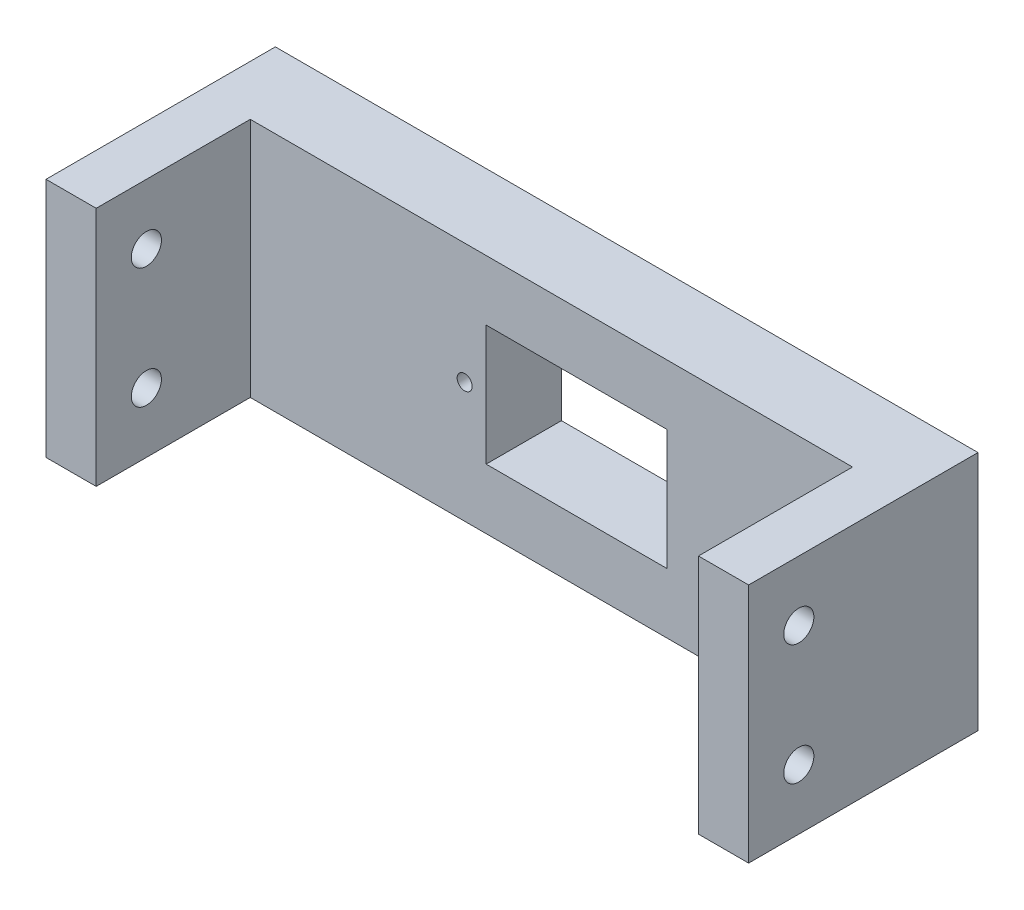
ISO-10303-21;
HEADER;
FILE_DESCRIPTION(('STEP AP214'),'2;1');
FILE_NAME('part.step','',(''),(''),'','','');
FILE_SCHEMA(('AUTOMOTIVE_DESIGN { 1 0 10303 214 1 1 1 1 }'));
ENDSEC;
DATA;
#1=APPLICATION_CONTEXT('core data for automotive mechanical design processes');
#2=APPLICATION_PROTOCOL_DEFINITION('international standard','automotive_design',2000,#1);
#3=PRODUCT_CONTEXT('',#1,'mechanical');
#4=PRODUCT('Part','Part','',(#3));
#5=PRODUCT_RELATED_PRODUCT_CATEGORY('part','',(#4));
#6=PRODUCT_DEFINITION_FORMATION('','',#4);
#7=PRODUCT_DEFINITION_CONTEXT('part definition',#1,'design');
#8=PRODUCT_DEFINITION('design','',#6,#7);
#9=PRODUCT_DEFINITION_SHAPE('','',#8);
#10=(LENGTH_UNIT() NAMED_UNIT(*) SI_UNIT(.MILLI.,.METRE.));
#11=(NAMED_UNIT(*) PLANE_ANGLE_UNIT() SI_UNIT($,.RADIAN.));
#12=(NAMED_UNIT(*) SI_UNIT($,.STERADIAN.) SOLID_ANGLE_UNIT());
#13=UNCERTAINTY_MEASURE_WITH_UNIT(LENGTH_MEASURE(1.E-05),#10,'distance_accuracy_value','');
#14=(GEOMETRIC_REPRESENTATION_CONTEXT(3) GLOBAL_UNCERTAINTY_ASSIGNED_CONTEXT((#13)) GLOBAL_UNIT_ASSIGNED_CONTEXT((#10,
#11,#12)) REPRESENTATION_CONTEXT('',''));
#15=CARTESIAN_POINT('',(0.,0.,0.));
#16=DIRECTION('',(0.,0.,1.));
#17=DIRECTION('',(1.,0.,0.));
#18=AXIS2_PLACEMENT_3D('',#15,#16,#17);
#19=CARTESIAN_POINT('',(-30.,24.,0.));
#20=DIRECTION('',(1.,0.,0.));
#21=DIRECTION('',(0.,0.,-1.));
#22=AXIS2_PLACEMENT_3D('',#19,#20,#21);
#23=PLANE('',#22);
#24=CARTESIAN_POINT('',(-30.,18.,14.1));
#25=DIRECTION('',(1.,0.,0.));
#26=DIRECTION('',(0.,0.,-1.));
#27=AXIS2_PLACEMENT_3D('',#24,#25,#26);
#28=CIRCLE('',#27,1.5);
#29=CARTESIAN_POINT('',(-30.,18.,12.6));
#30=VERTEX_POINT('',#29);
#31=EDGE_CURVE('E205',#30,#30,#28,.T.);
#32=ORIENTED_EDGE('',*,*,#31,.F.);
#33=EDGE_LOOP('',(#32));
#34=FACE_BOUND('',#33,.T.);
#35=CARTESIAN_POINT('',(-30.,6.,14.1));
#36=DIRECTION('',(1.,0.,0.));
#37=DIRECTION('',(0.,0.,-1.));
#38=AXIS2_PLACEMENT_3D('',#35,#36,#37);
#39=CIRCLE('',#38,1.5);
#40=CARTESIAN_POINT('',(-30.,6.,12.6));
#41=VERTEX_POINT('',#40);
#42=EDGE_CURVE('E197',#41,#41,#39,.T.);
#43=ORIENTED_EDGE('',*,*,#42,.F.);
#44=EDGE_LOOP('',(#43));
#45=FACE_BOUND('',#44,.T.);
#46=DIRECTION('',(0.,0.,1.));
#47=VECTOR('',#46,1.);
#48=CARTESIAN_POINT('',(-30.,0.,0.));
#49=LINE('',#48,#47);
#50=CARTESIAN_POINT('',(-30.,0.,3.74999999999998));
#51=VERTEX_POINT('',#50);
#52=CARTESIAN_POINT('',(-30.,0.,19.1));
#53=VERTEX_POINT('',#52);
#54=EDGE_CURVE('E209',#51,#53,#49,.T.);
#55=ORIENTED_EDGE('',*,*,#54,.F.);
#56=DIRECTION('',(0.,-1.,0.));
#57=VECTOR('',#56,1.);
#58=CARTESIAN_POINT('',(-30.,24.,3.74999999999998));
#59=LINE('',#58,#57);
#60=CARTESIAN_POINT('',(-30.,24.,3.74999999999998));
#61=VERTEX_POINT('',#60);
#62=EDGE_CURVE('E11',#61,#51,#59,.T.);
#63=ORIENTED_EDGE('',*,*,#62,.F.);
#64=DIRECTION('',(0.,0.,1.));
#65=VECTOR('',#64,1.);
#66=CARTESIAN_POINT('',(-30.,24.,0.));
#67=LINE('',#66,#65);
#68=CARTESIAN_POINT('',(-30.,24.,19.1));
#69=VERTEX_POINT('',#68);
#70=EDGE_CURVE('E210',#61,#69,#67,.T.);
#71=ORIENTED_EDGE('',*,*,#70,.T.);
#72=DIRECTION('',(0.,-1.,0.));
#73=VECTOR('',#72,1.);
#74=CARTESIAN_POINT('',(-30.,24.,19.1));
#75=LINE('',#74,#73);
#76=EDGE_CURVE('E239',#69,#53,#75,.T.);
#77=ORIENTED_EDGE('',*,*,#76,.T.);
#78=EDGE_LOOP('',(#55,#63,#71,#77));
#79=FACE_BOUND('',#78,.T.);
#80=ADVANCED_FACE('F42',(#34,#45,#79),#23,.T.);
#81=CARTESIAN_POINT('',(0.,24.,3.74999999999999));
#82=DIRECTION('',(0.,0.,-1.));
#83=DIRECTION('',(-1.,0.,0.));
#84=AXIS2_PLACEMENT_3D('',#81,#82,#83);
#85=PLANE('',#84);
#86=CARTESIAN_POINT('',(19.16,12.,3.74999999999999));
#87=DIRECTION('',(0.,0.,-1.));
#88=DIRECTION('',(-1.,0.,0.));
#89=AXIS2_PLACEMENT_3D('',#86,#87,#88);
#90=CIRCLE('',#89,0.750000000000002);
#91=CARTESIAN_POINT('',(18.41,12.,3.74999999999999));
#92=VERTEX_POINT('',#91);
#93=EDGE_CURVE('E388',#92,#92,#90,.T.);
#94=ORIENTED_EDGE('',*,*,#93,.T.);
#95=EDGE_LOOP('',(#94));
#96=FACE_BOUND('',#95,.T.);
#97=CARTESIAN_POINT('',(-8.64,12.,3.74999999999999));
#98=DIRECTION('',(0.,0.,-1.));
#99=DIRECTION('',(-1.,0.,0.));
#100=AXIS2_PLACEMENT_3D('',#97,#98,#99);
#101=CIRCLE('',#100,0.75);
#102=CARTESIAN_POINT('',(-9.39,12.,3.74999999999999));
#103=VERTEX_POINT('',#102);
#104=EDGE_CURVE('E390',#103,#103,#101,.T.);
#105=ORIENTED_EDGE('',*,*,#104,.T.);
#106=EDGE_LOOP('',(#105));
#107=FACE_BOUND('',#106,.T.);
#108=DIRECTION('',(1.,0.,0.));
#109=VECTOR('',#108,1.);
#110=CARTESIAN_POINT('',(-6.49999999999999,6.,3.74999999999999));
#111=LINE('',#110,#109);
#112=CARTESIAN_POINT('',(-6.5,6.,3.74999999999999));
#113=VERTEX_POINT('',#112);
#114=CARTESIAN_POINT('',(11.5,6.,3.74999999999999));
#115=VERTEX_POINT('',#114);
#116=EDGE_CURVE('E152',#113,#115,#111,.T.);
#117=ORIENTED_EDGE('',*,*,#116,.F.);
#118=DIRECTION('',(0.,-1.,0.));
#119=VECTOR('',#118,1.);
#120=CARTESIAN_POINT('',(-6.5,18.,3.74999999999999));
#121=LINE('',#120,#119);
#122=CARTESIAN_POINT('',(-6.5,18.,3.74999999999999));
#123=VERTEX_POINT('',#122);
#124=EDGE_CURVE('E132',#123,#113,#121,.T.);
#125=ORIENTED_EDGE('',*,*,#124,.F.);
#126=DIRECTION('',(-1.,0.,0.));
#127=VECTOR('',#126,1.);
#128=CARTESIAN_POINT('',(-6.49999999999999,18.,3.74999999999999));
#129=LINE('',#128,#127);
#130=CARTESIAN_POINT('',(11.5,18.,3.74999999999999));
#131=VERTEX_POINT('',#130);
#132=EDGE_CURVE('E142',#131,#123,#129,.T.);
#133=ORIENTED_EDGE('',*,*,#132,.F.);
#134=DIRECTION('',(0.,1.,0.));
#135=VECTOR('',#134,1.);
#136=CARTESIAN_POINT('',(11.5,18.,3.74999999999999));
#137=LINE('',#136,#135);
#138=EDGE_CURVE('E57',#115,#131,#137,.T.);
#139=ORIENTED_EDGE('',*,*,#138,.F.);
#140=EDGE_LOOP('',(#117,#125,#133,#139));
#141=FACE_BOUND('',#140,.T.);
#142=DIRECTION('',(1.,0.,0.));
#143=VECTOR('',#142,1.);
#144=CARTESIAN_POINT('',(0.,0.,3.74999999999999));
#145=LINE('',#144,#143);
#146=CARTESIAN_POINT('',(30.,0.,3.75));
#147=VERTEX_POINT('',#146);
#148=EDGE_CURVE('E243',#51,#147,#145,.T.);
#149=ORIENTED_EDGE('',*,*,#148,.T.);
#150=DIRECTION('',(0.,-1.,0.));
#151=VECTOR('',#150,1.);
#152=CARTESIAN_POINT('',(30.,24.,3.75));
#153=LINE('',#152,#151);
#154=CARTESIAN_POINT('',(30.,24.,3.75));
#155=VERTEX_POINT('',#154);
#156=EDGE_CURVE('E50',#155,#147,#153,.T.);
#157=ORIENTED_EDGE('',*,*,#156,.F.);
#158=DIRECTION('',(1.,0.,0.));
#159=VECTOR('',#158,1.);
#160=CARTESIAN_POINT('',(0.,24.,3.74999999999999));
#161=LINE('',#160,#159);
#162=EDGE_CURVE('E214',#61,#155,#161,.T.);
#163=ORIENTED_EDGE('',*,*,#162,.F.);
#164=ORIENTED_EDGE('',*,*,#62,.T.);
#165=EDGE_LOOP('',(#149,#157,#163,#164));
#166=FACE_BOUND('',#165,.T.);
#167=ADVANCED_FACE('F149',(#96,#107,#141,#166),#85,.F.);
#168=CARTESIAN_POINT('',(30.,24.,0.));
#169=DIRECTION('',(1.,0.,0.));
#170=DIRECTION('',(0.,0.,-1.));
#171=AXIS2_PLACEMENT_3D('',#168,#169,#170);
#172=PLANE('',#171);
#173=CARTESIAN_POINT('',(30.,18.,14.1));
#174=DIRECTION('',(1.,0.,0.));
#175=DIRECTION('',(0.,0.,-1.));
#176=AXIS2_PLACEMENT_3D('',#173,#174,#175);
#177=CIRCLE('',#176,1.5);
#178=CARTESIAN_POINT('',(30.,18.,12.6));
#179=VERTEX_POINT('',#178);
#180=EDGE_CURVE('E201',#179,#179,#177,.T.);
#181=ORIENTED_EDGE('',*,*,#180,.T.);
#182=EDGE_LOOP('',(#181));
#183=FACE_BOUND('',#182,.T.);
#184=CARTESIAN_POINT('',(30.,6.,14.1));
#185=DIRECTION('',(1.,0.,0.));
#186=DIRECTION('',(0.,0.,-1.));
#187=AXIS2_PLACEMENT_3D('',#184,#185,#186);
#188=CIRCLE('',#187,1.5);
#189=CARTESIAN_POINT('',(30.,6.,12.6));
#190=VERTEX_POINT('',#189);
#191=EDGE_CURVE('E182',#190,#190,#188,.T.);
#192=ORIENTED_EDGE('',*,*,#191,.T.);
#193=EDGE_LOOP('',(#192));
#194=FACE_BOUND('',#193,.T.);
#195=DIRECTION('',(0.,0.,1.));
#196=VECTOR('',#195,1.);
#197=CARTESIAN_POINT('',(30.,0.,0.));
#198=LINE('',#197,#196);
#199=CARTESIAN_POINT('',(30.,0.,19.1));
#200=VERTEX_POINT('',#199);
#201=EDGE_CURVE('E246',#147,#200,#198,.T.);
#202=ORIENTED_EDGE('',*,*,#201,.T.);
#203=DIRECTION('',(0.,-1.,0.));
#204=VECTOR('',#203,1.);
#205=CARTESIAN_POINT('',(30.,24.,19.1));
#206=LINE('',#205,#204);
#207=CARTESIAN_POINT('',(30.,24.,19.1));
#208=VERTEX_POINT('',#207);
#209=EDGE_CURVE('E283',#208,#200,#206,.T.);
#210=ORIENTED_EDGE('',*,*,#209,.F.);
#211=DIRECTION('',(0.,0.,1.));
#212=VECTOR('',#211,1.);
#213=CARTESIAN_POINT('',(30.,24.,0.));
#214=LINE('',#213,#212);
#215=EDGE_CURVE('E218',#155,#208,#214,.T.);
#216=ORIENTED_EDGE('',*,*,#215,.F.);
#217=ORIENTED_EDGE('',*,*,#156,.T.);
#218=EDGE_LOOP('',(#202,#210,#216,#217));
#219=FACE_BOUND('',#218,.T.);
#220=ADVANCED_FACE('F291',(#183,#194,#219),#172,.F.);
#221=CARTESIAN_POINT('',(0.,24.,19.1));
#222=DIRECTION('',(0.,0.,1.));
#223=DIRECTION('',(1.,0.,0.));
#224=AXIS2_PLACEMENT_3D('',#221,#222,#223);
#225=PLANE('',#224);
#226=DIRECTION('',(-1.,0.,0.));
#227=VECTOR('',#226,1.);
#228=CARTESIAN_POINT('',(0.,0.,19.1));
#229=LINE('',#228,#227);
#230=CARTESIAN_POINT('',(35.,0.,19.1));
#231=VERTEX_POINT('',#230);
#232=EDGE_CURVE('E250',#231,#200,#229,.T.);
#233=ORIENTED_EDGE('',*,*,#232,.F.);
#234=DIRECTION('',(0.,-1.,0.));
#235=VECTOR('',#234,1.);
#236=CARTESIAN_POINT('',(35.,24.,19.1));
#237=LINE('',#236,#235);
#238=CARTESIAN_POINT('',(35.,24.,19.1));
#239=VERTEX_POINT('',#238);
#240=EDGE_CURVE('E280',#239,#231,#237,.T.);
#241=ORIENTED_EDGE('',*,*,#240,.F.);
#242=DIRECTION('',(-1.,0.,0.));
#243=VECTOR('',#242,1.);
#244=CARTESIAN_POINT('',(0.,24.,19.1));
#245=LINE('',#244,#243);
#246=EDGE_CURVE('E221',#239,#208,#245,.T.);
#247=ORIENTED_EDGE('',*,*,#246,.T.);
#248=ORIENTED_EDGE('',*,*,#209,.T.);
#249=EDGE_LOOP('',(#233,#241,#247,#248));
#250=FACE_BOUND('',#249,.T.);
#251=ADVANCED_FACE('F301',(#250),#225,.T.);
#252=CARTESIAN_POINT('',(35.,24.,0.));
#253=DIRECTION('',(1.,0.,0.));
#254=DIRECTION('',(0.,0.,-1.));
#255=AXIS2_PLACEMENT_3D('',#252,#253,#254);
#256=PLANE('',#255);
#257=CARTESIAN_POINT('',(35.,18.,14.1));
#258=DIRECTION('',(-1.,0.,0.));
#259=DIRECTION('',(0.,0.,1.));
#260=AXIS2_PLACEMENT_3D('',#257,#258,#259);
#261=CIRCLE('',#260,1.5);
#262=CARTESIAN_POINT('',(35.,18.,15.6));
#263=VERTEX_POINT('',#262);
#264=EDGE_CURVE('E178',#263,#263,#261,.T.);
#265=ORIENTED_EDGE('',*,*,#264,.T.);
#266=EDGE_LOOP('',(#265));
#267=FACE_BOUND('',#266,.T.);
#268=CARTESIAN_POINT('',(35.,6.,14.1));
#269=DIRECTION('',(-1.,0.,0.));
#270=DIRECTION('',(0.,0.,1.));
#271=AXIS2_PLACEMENT_3D('',#268,#269,#270);
#272=CIRCLE('',#271,1.5);
#273=CARTESIAN_POINT('',(35.,6.,15.6));
#274=VERTEX_POINT('',#273);
#275=EDGE_CURVE('E187',#274,#274,#272,.T.);
#276=ORIENTED_EDGE('',*,*,#275,.T.);
#277=EDGE_LOOP('',(#276));
#278=FACE_BOUND('',#277,.T.);
#279=DIRECTION('',(0.,0.,1.));
#280=VECTOR('',#279,1.);
#281=CARTESIAN_POINT('',(35.,0.,0.));
#282=LINE('',#281,#280);
#283=CARTESIAN_POINT('',(35.,0.,-3.75));
#284=VERTEX_POINT('',#283);
#285=EDGE_CURVE('E254',#284,#231,#282,.T.);
#286=ORIENTED_EDGE('',*,*,#285,.F.);
#287=DIRECTION('',(0.,-1.,0.));
#288=VECTOR('',#287,1.);
#289=CARTESIAN_POINT('',(35.,24.,-3.75));
#290=LINE('',#289,#288);
#291=CARTESIAN_POINT('',(35.,24.,-3.75));
#292=VERTEX_POINT('',#291);
#293=EDGE_CURVE('E277',#292,#284,#290,.T.);
#294=ORIENTED_EDGE('',*,*,#293,.F.);
#295=DIRECTION('',(0.,0.,1.));
#296=VECTOR('',#295,1.);
#297=CARTESIAN_POINT('',(35.,24.,0.));
#298=LINE('',#297,#296);
#299=EDGE_CURVE('E225',#292,#239,#298,.T.);
#300=ORIENTED_EDGE('',*,*,#299,.T.);
#301=ORIENTED_EDGE('',*,*,#240,.T.);
#302=EDGE_LOOP('',(#286,#294,#300,#301));
#303=FACE_BOUND('',#302,.T.);
#304=ADVANCED_FACE('F309',(#267,#278,#303),#256,.T.);
#305=CARTESIAN_POINT('',(0.,24.,-3.74999999999999));
#306=DIRECTION('',(0.,0.,-1.));
#307=DIRECTION('',(-1.,0.,0.));
#308=AXIS2_PLACEMENT_3D('',#305,#306,#307);
#309=PLANE('',#308);
#310=CARTESIAN_POINT('',(19.16,12.,-3.75));
#311=DIRECTION('',(0.,0.,-1.));
#312=DIRECTION('',(-1.,0.,0.));
#313=AXIS2_PLACEMENT_3D('',#310,#311,#312);
#314=CIRCLE('',#313,0.750000000000002);
#315=CARTESIAN_POINT('',(18.41,12.,-3.74999999999999));
#316=VERTEX_POINT('',#315);
#317=EDGE_CURVE('E386',#316,#316,#314,.T.);
#318=ORIENTED_EDGE('',*,*,#317,.F.);
#319=EDGE_LOOP('',(#318));
#320=FACE_BOUND('',#319,.T.);
#321=CARTESIAN_POINT('',(-8.64,12.,-3.74999999999999));
#322=DIRECTION('',(0.,0.,-1.));
#323=DIRECTION('',(-1.,0.,0.));
#324=AXIS2_PLACEMENT_3D('',#321,#322,#323);
#325=CIRCLE('',#324,0.75);
#326=CARTESIAN_POINT('',(-9.39,12.,-3.74999999999999));
#327=VERTEX_POINT('',#326);
#328=EDGE_CURVE('E397',#327,#327,#325,.T.);
#329=ORIENTED_EDGE('',*,*,#328,.F.);
#330=EDGE_LOOP('',(#329));
#331=FACE_BOUND('',#330,.T.);
#332=DIRECTION('',(0.,1.,0.));
#333=VECTOR('',#332,1.);
#334=CARTESIAN_POINT('',(-6.5,18.,-3.74999999999999));
#335=LINE('',#334,#333);
#336=CARTESIAN_POINT('',(-6.5,6.,-3.74999999999999));
#337=VERTEX_POINT('',#336);
#338=CARTESIAN_POINT('',(-6.5,18.,-3.74999999999999));
#339=VERTEX_POINT('',#338);
#340=EDGE_CURVE('E65',#337,#339,#335,.T.);
#341=ORIENTED_EDGE('',*,*,#340,.F.);
#342=DIRECTION('',(-1.,0.,0.));
#343=VECTOR('',#342,1.);
#344=CARTESIAN_POINT('',(-6.5,6.,-3.74999999999999));
#345=LINE('',#344,#343);
#346=CARTESIAN_POINT('',(11.5,6.,-3.74999999999999));
#347=VERTEX_POINT('',#346);
#348=EDGE_CURVE('E139',#347,#337,#345,.T.);
#349=ORIENTED_EDGE('',*,*,#348,.F.);
#350=DIRECTION('',(0.,-1.,0.));
#351=VECTOR('',#350,1.);
#352=CARTESIAN_POINT('',(11.5,18.,-3.74999999999999));
#353=LINE('',#352,#351);
#354=CARTESIAN_POINT('',(11.5,18.,-3.74999999999999));
#355=VERTEX_POINT('',#354);
#356=EDGE_CURVE('E164',#355,#347,#353,.T.);
#357=ORIENTED_EDGE('',*,*,#356,.F.);
#358=DIRECTION('',(1.,0.,0.));
#359=VECTOR('',#358,1.);
#360=CARTESIAN_POINT('',(-6.5,18.,-3.74999999999999));
#361=LINE('',#360,#359);
#362=EDGE_CURVE('E157',#339,#355,#361,.T.);
#363=ORIENTED_EDGE('',*,*,#362,.F.);
#364=EDGE_LOOP('',(#341,#349,#357,#363));
#365=FACE_BOUND('',#364,.T.);
#366=DIRECTION('',(1.,0.,0.));
#367=VECTOR('',#366,1.);
#368=CARTESIAN_POINT('',(0.,0.,-3.74999999999999));
#369=LINE('',#368,#367);
#370=CARTESIAN_POINT('',(-35.,0.,-3.74999999999998));
#371=VERTEX_POINT('',#370);
#372=EDGE_CURVE('E258',#371,#284,#369,.T.);
#373=ORIENTED_EDGE('',*,*,#372,.F.);
#374=DIRECTION('',(0.,-1.,0.));
#375=VECTOR('',#374,1.);
#376=CARTESIAN_POINT('',(-35.,24.,-3.74999999999998));
#377=LINE('',#376,#375);
#378=CARTESIAN_POINT('',(-35.,24.,-3.74999999999998));
#379=VERTEX_POINT('',#378);
#380=EDGE_CURVE('E274',#379,#371,#377,.T.);
#381=ORIENTED_EDGE('',*,*,#380,.F.);
#382=DIRECTION('',(1.,0.,0.));
#383=VECTOR('',#382,1.);
#384=CARTESIAN_POINT('',(0.,24.,-3.74999999999999));
#385=LINE('',#384,#383);
#386=EDGE_CURVE('E229',#379,#292,#385,.T.);
#387=ORIENTED_EDGE('',*,*,#386,.T.);
#388=ORIENTED_EDGE('',*,*,#293,.T.);
#389=EDGE_LOOP('',(#373,#381,#387,#388));
#390=FACE_BOUND('',#389,.T.);
#391=ADVANCED_FACE('F312',(#320,#331,#365,#390),#309,.T.);
#392=CARTESIAN_POINT('',(-35.,24.,0.));
#393=DIRECTION('',(1.,0.,0.));
#394=DIRECTION('',(0.,0.,-1.));
#395=AXIS2_PLACEMENT_3D('',#392,#393,#394);
#396=PLANE('',#395);
#397=CARTESIAN_POINT('',(-35.,18.,14.1));
#398=DIRECTION('',(-1.,0.,0.));
#399=DIRECTION('',(0.,0.,1.));
#400=AXIS2_PLACEMENT_3D('',#397,#398,#399);
#401=CIRCLE('',#400,1.5);
#402=CARTESIAN_POINT('',(-35.,18.,15.6));
#403=VERTEX_POINT('',#402);
#404=EDGE_CURVE('E183',#403,#403,#401,.T.);
#405=ORIENTED_EDGE('',*,*,#404,.F.);
#406=EDGE_LOOP('',(#405));
#407=FACE_BOUND('',#406,.T.);
#408=CARTESIAN_POINT('',(-35.,6.,14.1));
#409=DIRECTION('',(-1.,0.,0.));
#410=DIRECTION('',(0.,0.,1.));
#411=AXIS2_PLACEMENT_3D('',#408,#409,#410);
#412=CIRCLE('',#411,1.5);
#413=CARTESIAN_POINT('',(-35.,6.,15.6));
#414=VERTEX_POINT('',#413);
#415=EDGE_CURVE('E146',#414,#414,#412,.T.);
#416=ORIENTED_EDGE('',*,*,#415,.F.);
#417=EDGE_LOOP('',(#416));
#418=FACE_BOUND('',#417,.T.);
#419=DIRECTION('',(0.,0.,1.));
#420=VECTOR('',#419,1.);
#421=CARTESIAN_POINT('',(-35.,0.,0.));
#422=LINE('',#421,#420);
#423=CARTESIAN_POINT('',(-35.,0.,19.1));
#424=VERTEX_POINT('',#423);
#425=EDGE_CURVE('E262',#371,#424,#422,.T.);
#426=ORIENTED_EDGE('',*,*,#425,.T.);
#427=DIRECTION('',(0.,-1.,0.));
#428=VECTOR('',#427,1.);
#429=CARTESIAN_POINT('',(-35.,24.,19.1));
#430=LINE('',#429,#428);
#431=CARTESIAN_POINT('',(-35.,24.,19.1));
#432=VERTEX_POINT('',#431);
#433=EDGE_CURVE('E270',#432,#424,#430,.T.);
#434=ORIENTED_EDGE('',*,*,#433,.F.);
#435=DIRECTION('',(0.,0.,1.));
#436=VECTOR('',#435,1.);
#437=CARTESIAN_POINT('',(-35.,24.,0.));
#438=LINE('',#437,#436);
#439=EDGE_CURVE('E233',#379,#432,#438,.T.);
#440=ORIENTED_EDGE('',*,*,#439,.F.);
#441=ORIENTED_EDGE('',*,*,#380,.T.);
#442=EDGE_LOOP('',(#426,#434,#440,#441));
#443=FACE_BOUND('',#442,.T.);
#444=ADVANCED_FACE('F318',(#407,#418,#443),#396,.F.);
#445=CARTESIAN_POINT('',(0.,24.,19.1));
#446=DIRECTION('',(0.,0.,-1.));
#447=DIRECTION('',(-1.,0.,0.));
#448=AXIS2_PLACEMENT_3D('',#445,#446,#447);
#449=PLANE('',#448);
#450=DIRECTION('',(1.,0.,0.));
#451=VECTOR('',#450,1.);
#452=CARTESIAN_POINT('',(0.,0.,19.1));
#453=LINE('',#452,#451);
#454=EDGE_CURVE('E215',#424,#53,#453,.T.);
#455=ORIENTED_EDGE('',*,*,#454,.T.);
#456=ORIENTED_EDGE('',*,*,#76,.F.);
#457=DIRECTION('',(1.,0.,0.));
#458=VECTOR('',#457,1.);
#459=CARTESIAN_POINT('',(0.,24.,19.1));
#460=LINE('',#459,#458);
#461=EDGE_CURVE('E236',#432,#69,#460,.T.);
#462=ORIENTED_EDGE('',*,*,#461,.F.);
#463=ORIENTED_EDGE('',*,*,#433,.T.);
#464=EDGE_LOOP('',(#455,#456,#462,#463));
#465=FACE_BOUND('',#464,.T.);
#466=ADVANCED_FACE('F322',(#465),#449,.F.);
#467=CARTESIAN_POINT('',(0.,24.,0.));
#468=DIRECTION('',(0.,1.,0.));
#469=DIRECTION('',(0.,0.,1.));
#470=AXIS2_PLACEMENT_3D('',#467,#468,#469);
#471=PLANE('',#470);
#472=ORIENTED_EDGE('',*,*,#70,.F.);
#473=ORIENTED_EDGE('',*,*,#162,.T.);
#474=ORIENTED_EDGE('',*,*,#215,.T.);
#475=ORIENTED_EDGE('',*,*,#246,.F.);
#476=ORIENTED_EDGE('',*,*,#299,.F.);
#477=ORIENTED_EDGE('',*,*,#386,.F.);
#478=ORIENTED_EDGE('',*,*,#439,.T.);
#479=ORIENTED_EDGE('',*,*,#461,.T.);
#480=EDGE_LOOP('',(#472,#473,#474,#475,#476,#477,#478,#479));
#481=FACE_BOUND('',#480,.T.);
#482=ADVANCED_FACE('F306',(#481),#471,.T.);
#483=CARTESIAN_POINT('',(0.,0.,0.));
#484=DIRECTION('',(0.,1.,0.));
#485=DIRECTION('',(0.,0.,1.));
#486=AXIS2_PLACEMENT_3D('',#483,#484,#485);
#487=PLANE('',#486);
#488=ORIENTED_EDGE('',*,*,#54,.T.);
#489=ORIENTED_EDGE('',*,*,#454,.F.);
#490=ORIENTED_EDGE('',*,*,#425,.F.);
#491=ORIENTED_EDGE('',*,*,#372,.T.);
#492=ORIENTED_EDGE('',*,*,#285,.T.);
#493=ORIENTED_EDGE('',*,*,#232,.T.);
#494=ORIENTED_EDGE('',*,*,#201,.F.);
#495=ORIENTED_EDGE('',*,*,#148,.F.);
#496=EDGE_LOOP('',(#488,#489,#490,#491,#492,#493,#494,#495));
#497=FACE_BOUND('',#496,.T.);
#498=ADVANCED_FACE('F296',(#497),#487,.F.);
#499=CARTESIAN_POINT('',(35.,6.,14.1));
#500=DIRECTION('',(-1.,0.,0.));
#501=DIRECTION('',(0.,0.,1.));
#502=AXIS2_PLACEMENT_3D('',#499,#500,#501);
#503=CYLINDRICAL_SURFACE('',#502,1.5);
#504=ORIENTED_EDGE('',*,*,#42,.T.);
#505=EDGE_LOOP('',(#504));
#506=FACE_BOUND('',#505,.T.);
#507=ORIENTED_EDGE('',*,*,#415,.T.);
#508=EDGE_LOOP('',(#507));
#509=FACE_BOUND('',#508,.T.);
#510=ADVANCED_FACE('F351',(#506,#509),#503,.F.);
#511=CARTESIAN_POINT('',(35.,18.,14.1));
#512=DIRECTION('',(-1.,0.,0.));
#513=DIRECTION('',(0.,0.,1.));
#514=AXIS2_PLACEMENT_3D('',#511,#512,#513);
#515=CYLINDRICAL_SURFACE('',#514,1.5);
#516=ORIENTED_EDGE('',*,*,#31,.T.);
#517=EDGE_LOOP('',(#516));
#518=FACE_BOUND('',#517,.T.);
#519=ORIENTED_EDGE('',*,*,#404,.T.);
#520=EDGE_LOOP('',(#519));
#521=FACE_BOUND('',#520,.T.);
#522=ADVANCED_FACE('F356',(#518,#521),#515,.F.);
#523=ORIENTED_EDGE('',*,*,#275,.F.);
#524=EDGE_LOOP('',(#523));
#525=FACE_BOUND('',#524,.T.);
#526=ORIENTED_EDGE('',*,*,#191,.F.);
#527=EDGE_LOOP('',(#526));
#528=FACE_BOUND('',#527,.T.);
#529=ADVANCED_FACE('F358',(#525,#528),#503,.F.);
#530=ORIENTED_EDGE('',*,*,#264,.F.);
#531=EDGE_LOOP('',(#530));
#532=FACE_BOUND('',#531,.T.);
#533=ORIENTED_EDGE('',*,*,#180,.F.);
#534=EDGE_LOOP('',(#533));
#535=FACE_BOUND('',#534,.T.);
#536=ADVANCED_FACE('F362',(#532,#535),#515,.F.);
#537=CARTESIAN_POINT('',(-6.49999999999999,18.,19.101));
#538=DIRECTION('',(-1.,0.,0.));
#539=DIRECTION('',(0.,0.,1.));
#540=AXIS2_PLACEMENT_3D('',#537,#538,#539);
#541=PLANE('',#540);
#542=ORIENTED_EDGE('',*,*,#124,.T.);
#543=DIRECTION('',(0.,0.,-1.));
#544=VECTOR('',#543,1.);
#545=CARTESIAN_POINT('',(-6.49999999999999,6.,19.101));
#546=LINE('',#545,#544);
#547=EDGE_CURVE('E147',#113,#337,#546,.T.);
#548=ORIENTED_EDGE('',*,*,#547,.T.);
#549=ORIENTED_EDGE('',*,*,#340,.T.);
#550=DIRECTION('',(0.,0.,-1.));
#551=VECTOR('',#550,1.);
#552=CARTESIAN_POINT('',(-6.49999999999999,18.,19.101));
#553=LINE('',#552,#551);
#554=EDGE_CURVE('E128',#123,#339,#553,.T.);
#555=ORIENTED_EDGE('',*,*,#554,.F.);
#556=EDGE_LOOP('',(#542,#548,#549,#555));
#557=FACE_BOUND('',#556,.T.);
#558=ADVANCED_FACE('F130',(#557),#541,.F.);
#559=CARTESIAN_POINT('',(-6.49999999999999,6.,19.101));
#560=DIRECTION('',(0.,-1.,0.));
#561=DIRECTION('',(1.,0.,0.));
#562=AXIS2_PLACEMENT_3D('',#559,#560,#561);
#563=PLANE('',#562);
#564=ORIENTED_EDGE('',*,*,#116,.T.);
#565=DIRECTION('',(0.,0.,-1.));
#566=VECTOR('',#565,1.);
#567=CARTESIAN_POINT('',(11.5,6.,19.101));
#568=LINE('',#567,#566);
#569=EDGE_CURVE('E173',#115,#347,#568,.T.);
#570=ORIENTED_EDGE('',*,*,#569,.T.);
#571=ORIENTED_EDGE('',*,*,#348,.T.);
#572=ORIENTED_EDGE('',*,*,#547,.F.);
#573=EDGE_LOOP('',(#564,#570,#571,#572));
#574=FACE_BOUND('',#573,.T.);
#575=ADVANCED_FACE('F365',(#574),#563,.F.);
#576=CARTESIAN_POINT('',(11.5,18.,19.101));
#577=DIRECTION('',(1.,0.,0.));
#578=DIRECTION('',(0.,0.,-1.));
#579=AXIS2_PLACEMENT_3D('',#576,#577,#578);
#580=PLANE('',#579);
#581=ORIENTED_EDGE('',*,*,#138,.T.);
#582=DIRECTION('',(0.,0.,-1.));
#583=VECTOR('',#582,1.);
#584=CARTESIAN_POINT('',(11.5,18.,19.101));
#585=LINE('',#584,#583);
#586=EDGE_CURVE('E138',#131,#355,#585,.T.);
#587=ORIENTED_EDGE('',*,*,#586,.T.);
#588=ORIENTED_EDGE('',*,*,#356,.T.);
#589=ORIENTED_EDGE('',*,*,#569,.F.);
#590=EDGE_LOOP('',(#581,#587,#588,#589));
#591=FACE_BOUND('',#590,.T.);
#592=ADVANCED_FACE('F369',(#591),#580,.F.);
#593=CARTESIAN_POINT('',(-6.49999999999999,18.,19.101));
#594=DIRECTION('',(0.,1.,0.));
#595=DIRECTION('',(-1.,0.,0.));
#596=AXIS2_PLACEMENT_3D('',#593,#594,#595);
#597=PLANE('',#596);
#598=ORIENTED_EDGE('',*,*,#132,.T.);
#599=ORIENTED_EDGE('',*,*,#554,.T.);
#600=ORIENTED_EDGE('',*,*,#362,.T.);
#601=ORIENTED_EDGE('',*,*,#586,.F.);
#602=EDGE_LOOP('',(#598,#599,#600,#601));
#603=FACE_BOUND('',#602,.T.);
#604=ADVANCED_FACE('F143',(#603),#597,.F.);
#605=CARTESIAN_POINT('',(-8.63999999999999,12.,19.1));
#606=DIRECTION('',(0.,0.,-1.));
#607=DIRECTION('',(-1.,0.,0.));
#608=AXIS2_PLACEMENT_3D('',#605,#606,#607);
#609=CYLINDRICAL_SURFACE('',#608,0.75);
#610=ORIENTED_EDGE('',*,*,#328,.T.);
#611=EDGE_LOOP('',(#610));
#612=FACE_BOUND('',#611,.T.);
#613=ORIENTED_EDGE('',*,*,#104,.F.);
#614=EDGE_LOOP('',(#613));
#615=FACE_BOUND('',#614,.T.);
#616=ADVANCED_FACE('F368',(#612,#615),#609,.F.);
#617=CARTESIAN_POINT('',(19.16,12.,19.1));
#618=DIRECTION('',(0.,0.,-1.));
#619=DIRECTION('',(-1.,0.,0.));
#620=AXIS2_PLACEMENT_3D('',#617,#618,#619);
#621=CYLINDRICAL_SURFACE('',#620,0.750000000000002);
#622=ORIENTED_EDGE('',*,*,#317,.T.);
#623=EDGE_LOOP('',(#622));
#624=FACE_BOUND('',#623,.T.);
#625=ORIENTED_EDGE('',*,*,#93,.F.);
#626=EDGE_LOOP('',(#625));
#627=FACE_BOUND('',#626,.T.);
#628=ADVANCED_FACE('F377',(#624,#627),#621,.F.);
#629=CLOSED_SHELL('',(#80,#167,#220,#251,#304,#391,#444,#466,#482,#498,#510,#522,#529,#536,#558,
#575,#592,#604,#616,#628));
#630=MANIFOLD_SOLID_BREP('B2',#629);
#631=ADVANCED_BREP_SHAPE_REPRESENTATION('',(#18,#630),#14);
#632=SHAPE_DEFINITION_REPRESENTATION(#9,#631);
ENDSEC;
END-ISO-10303-21;
